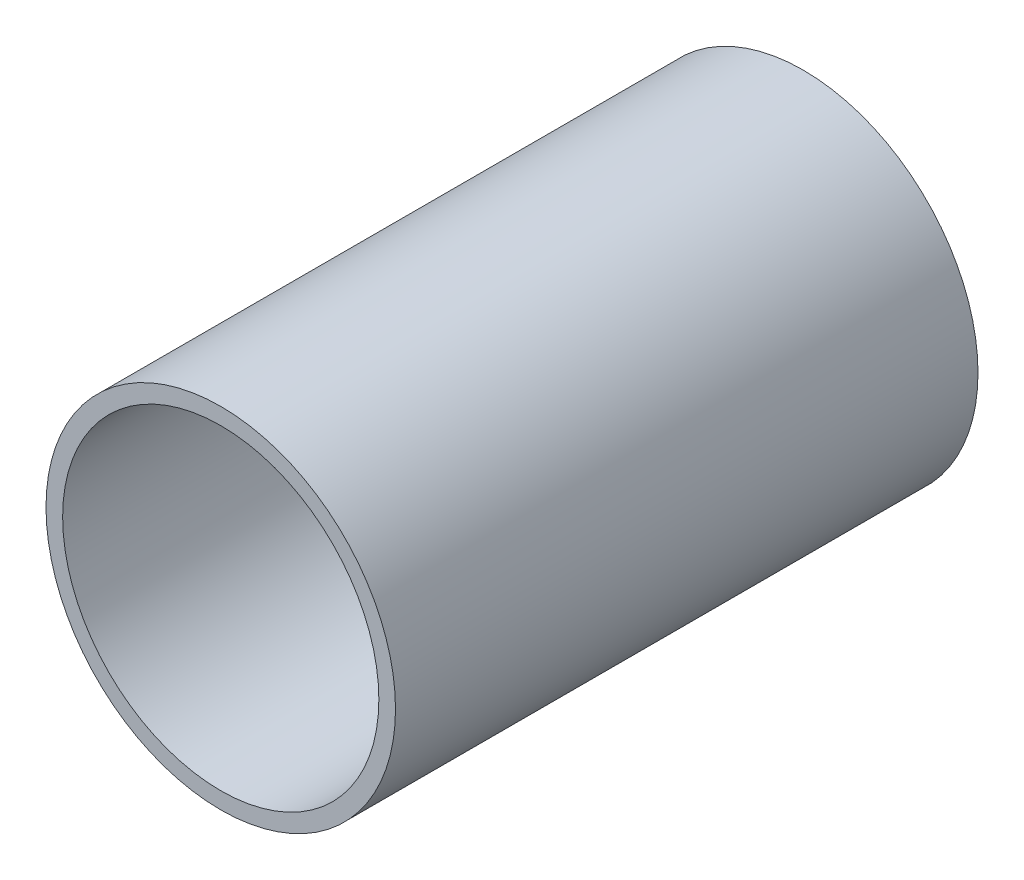
ISO-10303-21;
HEADER;
FILE_DESCRIPTION(('STEP AP214'),'2;1');
FILE_NAME('part.step','',(''),(''),'','','');
FILE_SCHEMA(('AUTOMOTIVE_DESIGN { 1 0 10303 214 1 1 1 1 }'));
ENDSEC;
DATA;
#1=APPLICATION_CONTEXT('core data for automotive mechanical design processes');
#2=APPLICATION_PROTOCOL_DEFINITION('international standard','automotive_design',2000,#1);
#3=PRODUCT_CONTEXT('',#1,'mechanical');
#4=PRODUCT('Part','Part','',(#3));
#5=PRODUCT_RELATED_PRODUCT_CATEGORY('part','',(#4));
#6=PRODUCT_DEFINITION_FORMATION('','',#4);
#7=PRODUCT_DEFINITION_CONTEXT('part definition',#1,'design');
#8=PRODUCT_DEFINITION('design','',#6,#7);
#9=PRODUCT_DEFINITION_SHAPE('','',#8);
#10=(LENGTH_UNIT() NAMED_UNIT(*) SI_UNIT(.MILLI.,.METRE.));
#11=(NAMED_UNIT(*) PLANE_ANGLE_UNIT() SI_UNIT($,.RADIAN.));
#12=(NAMED_UNIT(*) SI_UNIT($,.STERADIAN.) SOLID_ANGLE_UNIT());
#13=UNCERTAINTY_MEASURE_WITH_UNIT(LENGTH_MEASURE(1.E-05),#10,'distance_accuracy_value','');
#14=(GEOMETRIC_REPRESENTATION_CONTEXT(3) GLOBAL_UNCERTAINTY_ASSIGNED_CONTEXT((#13)) GLOBAL_UNIT_ASSIGNED_CONTEXT((#10,
#11,#12)) REPRESENTATION_CONTEXT('',''));
#15=CARTESIAN_POINT('',(0.,0.,0.));
#16=DIRECTION('',(0.,0.,1.));
#17=DIRECTION('',(1.,0.,0.));
#18=AXIS2_PLACEMENT_3D('',#15,#16,#17);
#19=CARTESIAN_POINT('',(0.,0.,70.));
#20=DIRECTION('',(0.,0.,1.));
#21=DIRECTION('',(1.,0.,0.));
#22=AXIS2_PLACEMENT_3D('',#19,#20,#21);
#23=PLANE('',#22);
#24=CARTESIAN_POINT('',(0.,0.,70.));
#25=DIRECTION('',(0.,0.,1.));
#26=DIRECTION('',(1.,0.,0.));
#27=AXIS2_PLACEMENT_3D('',#24,#25,#26);
#28=CIRCLE('',#27,21.);
#29=CARTESIAN_POINT('',(21.,0.,70.));
#30=VERTEX_POINT('',#29);
#31=EDGE_CURVE('E10',#30,#30,#28,.T.);
#32=ORIENTED_EDGE('',*,*,#31,.T.);
#33=EDGE_LOOP('',(#32));
#34=FACE_BOUND('',#33,.T.);
#35=CARTESIAN_POINT('',(0.,0.,70.));
#36=DIRECTION('',(0.,0.,1.));
#37=DIRECTION('',(1.,0.,0.));
#38=AXIS2_PLACEMENT_3D('',#35,#36,#37);
#39=CIRCLE('',#38,19.);
#40=CARTESIAN_POINT('',(19.,0.,70.));
#41=VERTEX_POINT('',#40);
#42=EDGE_CURVE('E57',#41,#41,#39,.T.);
#43=ORIENTED_EDGE('',*,*,#42,.F.);
#44=EDGE_LOOP('',(#43));
#45=FACE_BOUND('',#44,.T.);
#46=ADVANCED_FACE('F43',(#34,#45),#23,.T.);
#47=CARTESIAN_POINT('',(0.,0.,0.));
#48=DIRECTION('',(0.,0.,1.));
#49=DIRECTION('',(1.,0.,0.));
#50=AXIS2_PLACEMENT_3D('',#47,#48,#49);
#51=PLANE('',#50);
#52=CARTESIAN_POINT('',(0.,0.,0.));
#53=DIRECTION('',(0.,0.,1.));
#54=DIRECTION('',(1.,0.,0.));
#55=AXIS2_PLACEMENT_3D('',#52,#53,#54);
#56=CIRCLE('',#55,21.);
#57=CARTESIAN_POINT('',(21.,0.,0.));
#58=VERTEX_POINT('',#57);
#59=EDGE_CURVE('E48',#58,#58,#56,.T.);
#60=ORIENTED_EDGE('',*,*,#59,.F.);
#61=EDGE_LOOP('',(#60));
#62=FACE_BOUND('',#61,.T.);
#63=CARTESIAN_POINT('',(0.,0.,0.));
#64=DIRECTION('',(0.,0.,1.));
#65=DIRECTION('',(1.,0.,0.));
#66=AXIS2_PLACEMENT_3D('',#63,#64,#65);
#67=CIRCLE('',#66,19.);
#68=CARTESIAN_POINT('',(19.,0.,0.));
#69=VERTEX_POINT('',#68);
#70=EDGE_CURVE('E59',#69,#69,#67,.T.);
#71=ORIENTED_EDGE('',*,*,#70,.T.);
#72=EDGE_LOOP('',(#71));
#73=FACE_BOUND('',#72,.T.);
#74=ADVANCED_FACE('F71',(#62,#73),#51,.F.);
#75=CARTESIAN_POINT('',(0.,0.,70.));
#76=DIRECTION('',(0.,0.,-1.));
#77=DIRECTION('',(-1.,0.,0.));
#78=AXIS2_PLACEMENT_3D('',#75,#76,#77);
#79=CYLINDRICAL_SURFACE('',#78,21.);
#80=ORIENTED_EDGE('',*,*,#31,.F.);
#81=EDGE_LOOP('',(#80));
#82=FACE_BOUND('',#81,.T.);
#83=ORIENTED_EDGE('',*,*,#59,.T.);
#84=EDGE_LOOP('',(#83));
#85=FACE_BOUND('',#84,.T.);
#86=ADVANCED_FACE('F46',(#82,#85),#79,.T.);
#87=CARTESIAN_POINT('',(0.,0.,70.));
#88=DIRECTION('',(0.,0.,-1.));
#89=DIRECTION('',(-1.,0.,0.));
#90=AXIS2_PLACEMENT_3D('',#87,#88,#89);
#91=CYLINDRICAL_SURFACE('',#90,19.);
#92=ORIENTED_EDGE('',*,*,#42,.T.);
#93=EDGE_LOOP('',(#92));
#94=FACE_BOUND('',#93,.T.);
#95=ORIENTED_EDGE('',*,*,#70,.F.);
#96=EDGE_LOOP('',(#95));
#97=FACE_BOUND('',#96,.T.);
#98=ADVANCED_FACE('F67',(#94,#97),#91,.F.);
#99=CLOSED_SHELL('',(#46,#74,#86,#98));
#100=MANIFOLD_SOLID_BREP('B2',#99);
#101=ADVANCED_BREP_SHAPE_REPRESENTATION('',(#18,#100),#14);
#102=SHAPE_DEFINITION_REPRESENTATION(#9,#101);
ENDSEC;
END-ISO-10303-21;
